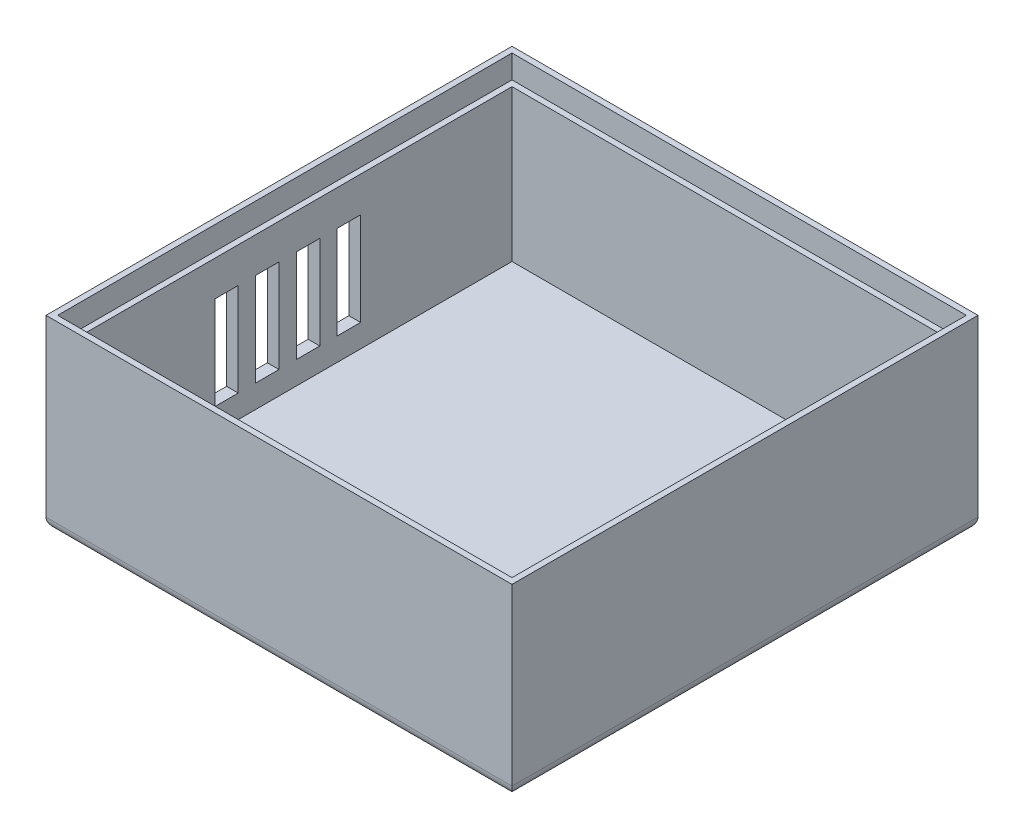
ISO-10303-21;
HEADER;
FILE_DESCRIPTION(('STEP AP214'),'2;1');
FILE_NAME('part.step','',(''),(''),'','','');
FILE_SCHEMA(('AUTOMOTIVE_DESIGN { 1 0 10303 214 1 1 1 1 }'));
ENDSEC;
DATA;
#1=APPLICATION_CONTEXT('core data for automotive mechanical design processes');
#2=APPLICATION_PROTOCOL_DEFINITION('international standard','automotive_design',2000,#1);
#3=PRODUCT_CONTEXT('',#1,'mechanical');
#4=PRODUCT('Part','Part','',(#3));
#5=PRODUCT_RELATED_PRODUCT_CATEGORY('part','',(#4));
#6=PRODUCT_DEFINITION_FORMATION('','',#4);
#7=PRODUCT_DEFINITION_CONTEXT('part definition',#1,'design');
#8=PRODUCT_DEFINITION('design','',#6,#7);
#9=PRODUCT_DEFINITION_SHAPE('','',#8);
#10=(LENGTH_UNIT() NAMED_UNIT(*) SI_UNIT(.MILLI.,.METRE.));
#11=(NAMED_UNIT(*) PLANE_ANGLE_UNIT() SI_UNIT($,.RADIAN.));
#12=(NAMED_UNIT(*) SI_UNIT($,.STERADIAN.) SOLID_ANGLE_UNIT());
#13=UNCERTAINTY_MEASURE_WITH_UNIT(LENGTH_MEASURE(1.E-05),#10,'distance_accuracy_value','');
#14=(GEOMETRIC_REPRESENTATION_CONTEXT(3) GLOBAL_UNCERTAINTY_ASSIGNED_CONTEXT((#13)) GLOBAL_UNIT_ASSIGNED_CONTEXT((#10,
#11,#12)) REPRESENTATION_CONTEXT('',''));
#15=CARTESIAN_POINT('',(0.,0.,0.));
#16=DIRECTION('',(0.,0.,1.));
#17=DIRECTION('',(1.,0.,0.));
#18=AXIS2_PLACEMENT_3D('',#15,#16,#17);
#19=CARTESIAN_POINT('',(-1.085,16.,-0.539));
#20=DIRECTION('',(1.,0.,0.));
#21=DIRECTION('',(0.,0.,-1.));
#22=AXIS2_PLACEMENT_3D('',#19,#20,#21);
#23=PLANE('',#22);
#24=DIRECTION('',(0.,0.,1.));
#25=VECTOR('',#24,1.);
#26=CARTESIAN_POINT('',(-1.085,2.97099138288034,13.461));
#27=LINE('',#26,#25);
#28=CARTESIAN_POINT('',(-1.085,2.97099138288034,13.461));
#29=VERTEX_POINT('',#28);
#30=CARTESIAN_POINT('',(-1.085,2.97099138288034,15.461));
#31=VERTEX_POINT('',#30);
#32=EDGE_CURVE('E248',#29,#31,#27,.T.);
#33=ORIENTED_EDGE('',*,*,#32,.F.);
#34=DIRECTION('',(0.,-1.,0.));
#35=VECTOR('',#34,1.);
#36=CARTESIAN_POINT('',(-1.085,10.9709913828803,13.461));
#37=LINE('',#36,#35);
#38=CARTESIAN_POINT('',(-1.085,10.9709913828803,13.461));
#39=VERTEX_POINT('',#38);
#40=EDGE_CURVE('E49',#39,#29,#37,.T.);
#41=ORIENTED_EDGE('',*,*,#40,.F.);
#42=DIRECTION('',(0.,0.,-1.));
#43=VECTOR('',#42,1.);
#44=CARTESIAN_POINT('',(-1.085,10.9709913828803,13.461));
#45=LINE('',#44,#43);
#46=CARTESIAN_POINT('',(-1.085,10.9709913828803,15.461));
#47=VERTEX_POINT('',#46);
#48=EDGE_CURVE('E254',#47,#39,#45,.T.);
#49=ORIENTED_EDGE('',*,*,#48,.F.);
#50=DIRECTION('',(0.,1.,0.));
#51=VECTOR('',#50,1.);
#52=CARTESIAN_POINT('',(-1.085,10.9709913828803,15.461));
#53=LINE('',#52,#51);
#54=EDGE_CURVE('E238',#31,#47,#53,.T.);
#55=ORIENTED_EDGE('',*,*,#54,.F.);
#56=EDGE_LOOP('',(#33,#41,#49,#55));
#57=FACE_BOUND('',#56,.T.);
#58=DIRECTION('',(0.,-1.,0.));
#59=VECTOR('',#58,1.);
#60=CARTESIAN_POINT('',(-1.085,10.9709913828803,16.961));
#61=LINE('',#60,#59);
#62=CARTESIAN_POINT('',(-1.085,10.9709913828803,16.961));
#63=VERTEX_POINT('',#62);
#64=CARTESIAN_POINT('',(-1.085,2.97099138288034,16.961));
#65=VERTEX_POINT('',#64);
#66=EDGE_CURVE('E265',#63,#65,#61,.T.);
#67=ORIENTED_EDGE('',*,*,#66,.F.);
#68=DIRECTION('',(0.,0.,-1.));
#69=VECTOR('',#68,1.);
#70=CARTESIAN_POINT('',(-1.085,10.9709913828803,16.961));
#71=LINE('',#70,#69);
#72=CARTESIAN_POINT('',(-1.085,10.9709913828803,18.961));
#73=VERTEX_POINT('',#72);
#74=EDGE_CURVE('E57',#73,#63,#71,.T.);
#75=ORIENTED_EDGE('',*,*,#74,.F.);
#76=DIRECTION('',(0.,1.,0.));
#77=VECTOR('',#76,1.);
#78=CARTESIAN_POINT('',(-1.085,10.9709913828803,18.961));
#79=LINE('',#78,#77);
#80=CARTESIAN_POINT('',(-1.085,2.97099138288034,18.961));
#81=VERTEX_POINT('',#80);
#82=EDGE_CURVE('E272',#81,#73,#79,.T.);
#83=ORIENTED_EDGE('',*,*,#82,.F.);
#84=DIRECTION('',(0.,0.,1.));
#85=VECTOR('',#84,1.);
#86=CARTESIAN_POINT('',(-1.085,2.97099138288034,16.961));
#87=LINE('',#86,#85);
#88=EDGE_CURVE('E269',#65,#81,#87,.T.);
#89=ORIENTED_EDGE('',*,*,#88,.F.);
#90=EDGE_LOOP('',(#67,#75,#83,#89));
#91=FACE_BOUND('',#90,.T.);
#92=DIRECTION('',(0.,-1.,0.));
#93=VECTOR('',#92,1.);
#94=CARTESIAN_POINT('',(-1.085,10.9709913828803,20.461));
#95=LINE('',#94,#93);
#96=CARTESIAN_POINT('',(-1.085,10.9709913828803,20.461));
#97=VERTEX_POINT('',#96);
#98=CARTESIAN_POINT('',(-1.085,2.97099138288034,20.461));
#99=VERTEX_POINT('',#98);
#100=EDGE_CURVE('E285',#97,#99,#95,.T.);
#101=ORIENTED_EDGE('',*,*,#100,.F.);
#102=DIRECTION('',(0.,0.,-1.));
#103=VECTOR('',#102,1.);
#104=CARTESIAN_POINT('',(-1.085,10.9709913828803,20.461));
#105=LINE('',#104,#103);
#106=CARTESIAN_POINT('',(-1.085,10.9709913828803,22.461));
#107=VERTEX_POINT('',#106);
#108=EDGE_CURVE('E283',#107,#97,#105,.T.);
#109=ORIENTED_EDGE('',*,*,#108,.F.);
#110=DIRECTION('',(0.,1.,0.));
#111=VECTOR('',#110,1.);
#112=CARTESIAN_POINT('',(-1.085,10.9709913828803,22.461));
#113=LINE('',#112,#111);
#114=CARTESIAN_POINT('',(-1.085,2.97099138288034,22.461));
#115=VERTEX_POINT('',#114);
#116=EDGE_CURVE('E292',#115,#107,#113,.T.);
#117=ORIENTED_EDGE('',*,*,#116,.F.);
#118=DIRECTION('',(0.,0.,1.));
#119=VECTOR('',#118,1.);
#120=CARTESIAN_POINT('',(-1.085,2.97099138288034,20.461));
#121=LINE('',#120,#119);
#122=EDGE_CURVE('E289',#99,#115,#121,.T.);
#123=ORIENTED_EDGE('',*,*,#122,.F.);
#124=EDGE_LOOP('',(#101,#109,#117,#123));
#125=FACE_BOUND('',#124,.T.);
#126=DIRECTION('',(0.,-1.,0.));
#127=VECTOR('',#126,1.);
#128=CARTESIAN_POINT('',(-1.085,10.9709913828803,23.961));
#129=LINE('',#128,#127);
#130=CARTESIAN_POINT('',(-1.085,10.9709913828803,23.961));
#131=VERTEX_POINT('',#130);
#132=CARTESIAN_POINT('',(-1.085,2.97099138288034,23.961));
#133=VERTEX_POINT('',#132);
#134=EDGE_CURVE('E305',#131,#133,#129,.T.);
#135=ORIENTED_EDGE('',*,*,#134,.F.);
#136=DIRECTION('',(0.,0.,-1.));
#137=VECTOR('',#136,1.);
#138=CARTESIAN_POINT('',(-1.085,10.9709913828803,23.961));
#139=LINE('',#138,#137);
#140=CARTESIAN_POINT('',(-1.085,10.9709913828803,25.961));
#141=VERTEX_POINT('',#140);
#142=EDGE_CURVE('E303',#141,#131,#139,.T.);
#143=ORIENTED_EDGE('',*,*,#142,.F.);
#144=DIRECTION('',(0.,1.,0.));
#145=VECTOR('',#144,1.);
#146=CARTESIAN_POINT('',(-1.085,10.9709913828803,25.961));
#147=LINE('',#146,#145);
#148=CARTESIAN_POINT('',(-1.085,2.97099138288034,25.961));
#149=VERTEX_POINT('',#148);
#150=EDGE_CURVE('E311',#149,#141,#147,.T.);
#151=ORIENTED_EDGE('',*,*,#150,.F.);
#152=DIRECTION('',(0.,0.,1.));
#153=VECTOR('',#152,1.);
#154=CARTESIAN_POINT('',(-1.085,2.97099138288034,23.961));
#155=LINE('',#154,#153);
#156=EDGE_CURVE('E308',#133,#149,#155,.T.);
#157=ORIENTED_EDGE('',*,*,#156,.F.);
#158=EDGE_LOOP('',(#135,#143,#151,#157));
#159=FACE_BOUND('',#158,.T.);
#160=DIRECTION('',(0.,-1.,0.));
#161=VECTOR('',#160,1.);
#162=CARTESIAN_POINT('',(-1.085,16.,-0.539));
#163=LINE('',#162,#161);
#164=CARTESIAN_POINT('',(-1.085,16.,-0.539));
#165=VERTEX_POINT('',#164);
#166=CARTESIAN_POINT('',(-1.085,1.,-0.539));
#167=VERTEX_POINT('',#166);
#168=EDGE_CURVE('E399',#165,#167,#163,.T.);
#169=ORIENTED_EDGE('',*,*,#168,.T.);
#170=DIRECTION('',(0.,0.,1.));
#171=VECTOR('',#170,1.);
#172=CARTESIAN_POINT('',(-1.085,1.,-0.539));
#173=LINE('',#172,#171);
#174=CARTESIAN_POINT('',(-1.085,1.,39.461));
#175=VERTEX_POINT('',#174);
#176=EDGE_CURVE('E425',#167,#175,#173,.T.);
#177=ORIENTED_EDGE('',*,*,#176,.T.);
#178=DIRECTION('',(0.,-1.,0.));
#179=VECTOR('',#178,1.);
#180=CARTESIAN_POINT('',(-1.085,16.,39.461));
#181=LINE('',#180,#179);
#182=CARTESIAN_POINT('',(-1.085,16.,39.461));
#183=VERTEX_POINT('',#182);
#184=EDGE_CURVE('E408',#183,#175,#181,.T.);
#185=ORIENTED_EDGE('',*,*,#184,.F.);
#186=DIRECTION('',(0.,0.,1.));
#187=VECTOR('',#186,1.);
#188=CARTESIAN_POINT('',(-1.085,16.,-0.539));
#189=LINE('',#188,#187);
#190=EDGE_CURVE('E382',#165,#183,#189,.T.);
#191=ORIENTED_EDGE('',*,*,#190,.F.);
#192=EDGE_LOOP('',(#169,#177,#185,#191));
#193=FACE_BOUND('',#192,.T.);
#194=ADVANCED_FACE('F34',(#57,#91,#125,#159,#193),#23,.F.);
#195=CARTESIAN_POINT('',(-1.085,16.,39.461));
#196=DIRECTION('',(0.,0.,-1.));
#197=DIRECTION('',(-1.,0.,0.));
#198=AXIS2_PLACEMENT_3D('',#195,#196,#197);
#199=PLANE('',#198);
#200=ORIENTED_EDGE('',*,*,#184,.T.);
#201=DIRECTION('',(1.,0.,0.));
#202=VECTOR('',#201,1.);
#203=CARTESIAN_POINT('',(-1.085,1.,39.461));
#204=LINE('',#203,#202);
#205=CARTESIAN_POINT('',(38.915,1.,39.461));
#206=VERTEX_POINT('',#205);
#207=EDGE_CURVE('E423',#175,#206,#204,.T.);
#208=ORIENTED_EDGE('',*,*,#207,.T.);
#209=DIRECTION('',(0.,-1.,0.));
#210=VECTOR('',#209,1.);
#211=CARTESIAN_POINT('',(38.915,16.,39.461));
#212=LINE('',#211,#210);
#213=CARTESIAN_POINT('',(38.915,16.,39.461));
#214=VERTEX_POINT('',#213);
#215=EDGE_CURVE('E405',#214,#206,#212,.T.);
#216=ORIENTED_EDGE('',*,*,#215,.F.);
#217=DIRECTION('',(1.,0.,0.));
#218=VECTOR('',#217,1.);
#219=CARTESIAN_POINT('',(-1.085,16.,39.461));
#220=LINE('',#219,#218);
#221=EDGE_CURVE('E393',#183,#214,#220,.T.);
#222=ORIENTED_EDGE('',*,*,#221,.F.);
#223=EDGE_LOOP('',(#200,#208,#216,#222));
#224=FACE_BOUND('',#223,.T.);
#225=ADVANCED_FACE('F497',(#224),#199,.F.);
#226=CARTESIAN_POINT('',(38.915,16.,-0.539));
#227=DIRECTION('',(-1.,0.,0.));
#228=DIRECTION('',(0.,0.,1.));
#229=AXIS2_PLACEMENT_3D('',#226,#227,#228);
#230=PLANE('',#229);
#231=ORIENTED_EDGE('',*,*,#215,.T.);
#232=DIRECTION('',(0.,0.,-1.));
#233=VECTOR('',#232,1.);
#234=CARTESIAN_POINT('',(38.915,1.,-0.539));
#235=LINE('',#234,#233);
#236=CARTESIAN_POINT('',(38.915,1.,-0.539));
#237=VERTEX_POINT('',#236);
#238=EDGE_CURVE('E411',#206,#237,#235,.T.);
#239=ORIENTED_EDGE('',*,*,#238,.T.);
#240=DIRECTION('',(0.,-1.,0.));
#241=VECTOR('',#240,1.);
#242=CARTESIAN_POINT('',(38.915,16.,-0.539));
#243=LINE('',#242,#241);
#244=CARTESIAN_POINT('',(38.915,16.,-0.539));
#245=VERTEX_POINT('',#244);
#246=EDGE_CURVE('E402',#245,#237,#243,.T.);
#247=ORIENTED_EDGE('',*,*,#246,.F.);
#248=DIRECTION('',(0.,0.,-1.));
#249=VECTOR('',#248,1.);
#250=CARTESIAN_POINT('',(38.915,16.,-0.539));
#251=LINE('',#250,#249);
#252=EDGE_CURVE('E395',#214,#245,#251,.T.);
#253=ORIENTED_EDGE('',*,*,#252,.F.);
#254=EDGE_LOOP('',(#231,#239,#247,#253));
#255=FACE_BOUND('',#254,.T.);
#256=ADVANCED_FACE('F502',(#255),#230,.F.);
#257=CARTESIAN_POINT('',(-1.085,16.,-0.539));
#258=DIRECTION('',(0.,0.,1.));
#259=DIRECTION('',(1.,0.,0.));
#260=AXIS2_PLACEMENT_3D('',#257,#258,#259);
#261=PLANE('',#260);
#262=ORIENTED_EDGE('',*,*,#246,.T.);
#263=DIRECTION('',(-1.,0.,0.));
#264=VECTOR('',#263,1.);
#265=CARTESIAN_POINT('',(-1.085,1.,-0.539));
#266=LINE('',#265,#264);
#267=EDGE_CURVE('E427',#237,#167,#266,.T.);
#268=ORIENTED_EDGE('',*,*,#267,.T.);
#269=ORIENTED_EDGE('',*,*,#168,.F.);
#270=DIRECTION('',(-1.,0.,0.));
#271=VECTOR('',#270,1.);
#272=CARTESIAN_POINT('',(-1.085,16.,-0.539));
#273=LINE('',#272,#271);
#274=EDGE_CURVE('E397',#245,#165,#273,.T.);
#275=ORIENTED_EDGE('',*,*,#274,.F.);
#276=EDGE_LOOP('',(#262,#268,#269,#275));
#277=FACE_BOUND('',#276,.T.);
#278=ADVANCED_FACE('F544',(#277),#261,.F.);
#279=CARTESIAN_POINT('',(0.,16.,0.));
#280=DIRECTION('',(0.,1.,0.));
#281=DIRECTION('',(0.,0.,1.));
#282=AXIS2_PLACEMENT_3D('',#279,#280,#281);
#283=PLANE('',#282);
#284=DIRECTION('',(-1.,0.,0.));
#285=VECTOR('',#284,1.);
#286=CARTESIAN_POINT('',(37.915,16.,-0.039));
#287=LINE('',#286,#285);
#288=CARTESIAN_POINT('',(38.415,16.,-0.0390000000000001));
#289=VERTEX_POINT('',#288);
#290=CARTESIAN_POINT('',(-0.585000000000013,16.,-0.039));
#291=VERTEX_POINT('',#290);
#292=EDGE_CURVE('E336',#289,#291,#287,.T.);
#293=ORIENTED_EDGE('',*,*,#292,.F.);
#294=DIRECTION('',(0.,0.,-1.));
#295=VECTOR('',#294,1.);
#296=CARTESIAN_POINT('',(38.415,16.,-0.0390000000000001));
#297=LINE('',#296,#295);
#298=CARTESIAN_POINT('',(38.415,16.,38.961));
#299=VERTEX_POINT('',#298);
#300=EDGE_CURVE('E331',#299,#289,#297,.T.);
#301=ORIENTED_EDGE('',*,*,#300,.F.);
#302=DIRECTION('',(1.,0.,0.));
#303=VECTOR('',#302,1.);
#304=CARTESIAN_POINT('',(37.915,16.,38.961));
#305=LINE('',#304,#303);
#306=CARTESIAN_POINT('',(-0.584999999999996,16.,38.961));
#307=VERTEX_POINT('',#306);
#308=EDGE_CURVE('E360',#307,#299,#305,.T.);
#309=ORIENTED_EDGE('',*,*,#308,.F.);
#310=DIRECTION('',(0.,0.,1.));
#311=VECTOR('',#310,1.);
#312=CARTESIAN_POINT('',(-0.585000000000001,16.,0.461));
#313=LINE('',#312,#311);
#314=EDGE_CURVE('E347',#291,#307,#313,.T.);
#315=ORIENTED_EDGE('',*,*,#314,.F.);
#316=EDGE_LOOP('',(#293,#301,#309,#315));
#317=FACE_BOUND('',#316,.T.);
#318=ORIENTED_EDGE('',*,*,#190,.T.);
#319=ORIENTED_EDGE('',*,*,#221,.T.);
#320=ORIENTED_EDGE('',*,*,#252,.T.);
#321=ORIENTED_EDGE('',*,*,#274,.T.);
#322=EDGE_LOOP('',(#318,#319,#320,#321));
#323=FACE_BOUND('',#322,.T.);
#324=ADVANCED_FACE('F547',(#317,#323),#283,.T.);
#325=CARTESIAN_POINT('',(0.,0.,0.));
#326=DIRECTION('',(0.,1.,0.));
#327=DIRECTION('',(0.,0.,1.));
#328=AXIS2_PLACEMENT_3D('',#325,#326,#327);
#329=PLANE('',#328);
#330=DIRECTION('',(-1.,0.,0.));
#331=VECTOR('',#330,1.);
#332=CARTESIAN_POINT('',(0.,0.,0.461));
#333=LINE('',#332,#331);
#334=CARTESIAN_POINT('',(-0.0850000000000003,0.,0.461));
#335=VERTEX_POINT('',#334);
#336=CARTESIAN_POINT('',(37.915,0.,0.461));
#337=VERTEX_POINT('',#336);
#338=EDGE_CURVE('E414',#335,#337,#333,.F.);
#339=ORIENTED_EDGE('',*,*,#338,.T.);
#340=DIRECTION('',(0.,0.,-1.));
#341=VECTOR('',#340,1.);
#342=CARTESIAN_POINT('',(37.915,0.,0.));
#343=LINE('',#342,#341);
#344=CARTESIAN_POINT('',(37.915,0.,38.461));
#345=VERTEX_POINT('',#344);
#346=EDGE_CURVE('E420',#337,#345,#343,.F.);
#347=ORIENTED_EDGE('',*,*,#346,.T.);
#348=DIRECTION('',(1.,0.,0.));
#349=VECTOR('',#348,1.);
#350=CARTESIAN_POINT('',(0.,0.,38.461));
#351=LINE('',#350,#349);
#352=CARTESIAN_POINT('',(-0.0849999999999956,0.,38.461));
#353=VERTEX_POINT('',#352);
#354=EDGE_CURVE('E418',#345,#353,#351,.F.);
#355=ORIENTED_EDGE('',*,*,#354,.T.);
#356=DIRECTION('',(0.,0.,1.));
#357=VECTOR('',#356,1.);
#358=CARTESIAN_POINT('',(-0.0850000000000004,0.,0.));
#359=LINE('',#358,#357);
#360=EDGE_CURVE('E416',#353,#335,#359,.F.);
#361=ORIENTED_EDGE('',*,*,#360,.T.);
#362=EDGE_LOOP('',(#339,#347,#355,#361));
#363=FACE_BOUND('',#362,.T.);
#364=ADVANCED_FACE('F532',(#363),#329,.F.);
#365=CARTESIAN_POINT('',(-0.0850000000000007,1.,0.461));
#366=DIRECTION('',(-1.,0.,0.));
#367=DIRECTION('',(0.,0.,1.));
#368=AXIS2_PLACEMENT_3D('',#365,#366,#367);
#369=PLANE('',#368);
#370=DIRECTION('',(0.,0.,-1.));
#371=VECTOR('',#370,1.);
#372=CARTESIAN_POINT('',(-0.0850000000000007,10.9709913828803,0.461));
#373=LINE('',#372,#371);
#374=CARTESIAN_POINT('',(-0.0849999999999983,10.9709913828803,15.461));
#375=VERTEX_POINT('',#374);
#376=CARTESIAN_POINT('',(-0.0849999999999983,10.9709913828803,13.461));
#377=VERTEX_POINT('',#376);
#378=EDGE_CURVE('E42',#375,#377,#373,.T.);
#379=ORIENTED_EDGE('',*,*,#378,.T.);
#380=DIRECTION('',(0.,-1.,0.));
#381=VECTOR('',#380,1.);
#382=CARTESIAN_POINT('',(-0.084999999999999,1.00000000000001,13.461));
#383=LINE('',#382,#381);
#384=CARTESIAN_POINT('',(-0.0849999999999983,2.97099138288034,13.461));
#385=VERTEX_POINT('',#384);
#386=EDGE_CURVE('E11',#377,#385,#383,.T.);
#387=ORIENTED_EDGE('',*,*,#386,.T.);
#388=DIRECTION('',(0.,0.,1.));
#389=VECTOR('',#388,1.);
#390=CARTESIAN_POINT('',(-0.0850000000000007,2.97099138288034,0.461));
#391=LINE('',#390,#389);
#392=CARTESIAN_POINT('',(-0.0849999999999988,2.97099138288034,15.461));
#393=VERTEX_POINT('',#392);
#394=EDGE_CURVE('E473',#385,#393,#391,.T.);
#395=ORIENTED_EDGE('',*,*,#394,.T.);
#396=DIRECTION('',(0.,1.,0.));
#397=VECTOR('',#396,1.);
#398=CARTESIAN_POINT('',(-0.0849999999999988,1.,15.461));
#399=LINE('',#398,#397);
#400=EDGE_CURVE('E241',#393,#375,#399,.T.);
#401=ORIENTED_EDGE('',*,*,#400,.T.);
#402=EDGE_LOOP('',(#379,#387,#395,#401));
#403=FACE_BOUND('',#402,.T.);
#404=DIRECTION('',(0.,1.,0.));
#405=VECTOR('',#404,1.);
#406=CARTESIAN_POINT('',(-0.0849999999999983,1.00000000000001,18.961));
#407=LINE('',#406,#405);
#408=CARTESIAN_POINT('',(-0.0849999999999983,2.97099138288034,18.961));
#409=VERTEX_POINT('',#408);
#410=CARTESIAN_POINT('',(-0.0849999999999983,10.9709913828803,18.961));
#411=VERTEX_POINT('',#410);
#412=EDGE_CURVE('E467',#409,#411,#407,.T.);
#413=ORIENTED_EDGE('',*,*,#412,.T.);
#414=DIRECTION('',(0.,0.,-1.));
#415=VECTOR('',#414,1.);
#416=CARTESIAN_POINT('',(-0.0850000000000007,10.9709913828803,0.461));
#417=LINE('',#416,#415);
#418=CARTESIAN_POINT('',(-0.0849999999999983,10.9709913828803,16.961));
#419=VERTEX_POINT('',#418);
#420=EDGE_CURVE('E470',#411,#419,#417,.T.);
#421=ORIENTED_EDGE('',*,*,#420,.T.);
#422=DIRECTION('',(0.,-1.,0.));
#423=VECTOR('',#422,1.);
#424=CARTESIAN_POINT('',(-0.0849999999999986,1.00000000000001,16.961));
#425=LINE('',#424,#423);
#426=CARTESIAN_POINT('',(-0.0849999999999986,2.97099138288034,16.961));
#427=VERTEX_POINT('',#426);
#428=EDGE_CURVE('E461',#419,#427,#425,.T.);
#429=ORIENTED_EDGE('',*,*,#428,.T.);
#430=DIRECTION('',(0.,0.,1.));
#431=VECTOR('',#430,1.);
#432=CARTESIAN_POINT('',(-0.0850000000000007,2.97099138288034,0.461));
#433=LINE('',#432,#431);
#434=EDGE_CURVE('E464',#427,#409,#433,.T.);
#435=ORIENTED_EDGE('',*,*,#434,.T.);
#436=EDGE_LOOP('',(#413,#421,#429,#435));
#437=FACE_BOUND('',#436,.T.);
#438=DIRECTION('',(0.,1.,0.));
#439=VECTOR('',#438,1.);
#440=CARTESIAN_POINT('',(-0.0849999999999979,1.,22.461));
#441=LINE('',#440,#439);
#442=CARTESIAN_POINT('',(-0.0849999999999983,2.97099138288034,22.461));
#443=VERTEX_POINT('',#442);
#444=CARTESIAN_POINT('',(-0.0849999999999983,10.9709913828803,22.461));
#445=VERTEX_POINT('',#444);
#446=EDGE_CURVE('E455',#443,#445,#441,.T.);
#447=ORIENTED_EDGE('',*,*,#446,.T.);
#448=DIRECTION('',(0.,0.,-1.));
#449=VECTOR('',#448,1.);
#450=CARTESIAN_POINT('',(-0.0850000000000007,10.9709913828803,0.461));
#451=LINE('',#450,#449);
#452=CARTESIAN_POINT('',(-0.0849999999999983,10.9709913828803,20.461));
#453=VERTEX_POINT('',#452);
#454=EDGE_CURVE('E458',#445,#453,#451,.T.);
#455=ORIENTED_EDGE('',*,*,#454,.T.);
#456=DIRECTION('',(0.,-1.,0.));
#457=VECTOR('',#456,1.);
#458=CARTESIAN_POINT('',(-0.0849999999999981,1.00000000000001,20.461));
#459=LINE('',#458,#457);
#460=CARTESIAN_POINT('',(-0.0849999999999981,2.97099138288034,20.461));
#461=VERTEX_POINT('',#460);
#462=EDGE_CURVE('E449',#453,#461,#459,.T.);
#463=ORIENTED_EDGE('',*,*,#462,.T.);
#464=DIRECTION('',(0.,0.,1.));
#465=VECTOR('',#464,1.);
#466=CARTESIAN_POINT('',(-0.0850000000000007,2.97099138288034,0.461));
#467=LINE('',#466,#465);
#468=EDGE_CURVE('E452',#461,#443,#467,.T.);
#469=ORIENTED_EDGE('',*,*,#468,.T.);
#470=EDGE_LOOP('',(#447,#455,#463,#469));
#471=FACE_BOUND('',#470,.T.);
#472=DIRECTION('',(0.,1.,0.));
#473=VECTOR('',#472,1.);
#474=CARTESIAN_POINT('',(-0.0849999999999974,1.00000000000001,25.961));
#475=LINE('',#474,#473);
#476=CARTESIAN_POINT('',(-0.0849999999999983,2.97099138288034,25.961));
#477=VERTEX_POINT('',#476);
#478=CARTESIAN_POINT('',(-0.0849999999999965,10.9709913828803,25.961));
#479=VERTEX_POINT('',#478);
#480=EDGE_CURVE('E443',#477,#479,#475,.T.);
#481=ORIENTED_EDGE('',*,*,#480,.T.);
#482=DIRECTION('',(0.,0.,-1.));
#483=VECTOR('',#482,1.);
#484=CARTESIAN_POINT('',(-0.0850000000000007,10.9709913828803,0.461));
#485=LINE('',#484,#483);
#486=CARTESIAN_POINT('',(-0.0849999999999983,10.9709913828803,23.961));
#487=VERTEX_POINT('',#486);
#488=EDGE_CURVE('E446',#479,#487,#485,.T.);
#489=ORIENTED_EDGE('',*,*,#488,.T.);
#490=DIRECTION('',(0.,-1.,0.));
#491=VECTOR('',#490,1.);
#492=CARTESIAN_POINT('',(-0.0849999999999977,1.00000000000001,23.961));
#493=LINE('',#492,#491);
#494=CARTESIAN_POINT('',(-0.0849999999999977,2.97099138288034,23.961));
#495=VERTEX_POINT('',#494);
#496=EDGE_CURVE('E429',#487,#495,#493,.T.);
#497=ORIENTED_EDGE('',*,*,#496,.T.);
#498=DIRECTION('',(0.,0.,1.));
#499=VECTOR('',#498,1.);
#500=CARTESIAN_POINT('',(-0.0850000000000007,2.97099138288034,0.461));
#501=LINE('',#500,#499);
#502=EDGE_CURVE('E440',#495,#477,#501,.T.);
#503=ORIENTED_EDGE('',*,*,#502,.T.);
#504=EDGE_LOOP('',(#481,#489,#497,#503));
#505=FACE_BOUND('',#504,.T.);
#506=DIRECTION('',(0.,1.,0.));
#507=VECTOR('',#506,1.);
#508=CARTESIAN_POINT('',(-0.0850000000000007,1.,0.461));
#509=LINE('',#508,#507);
#510=CARTESIAN_POINT('',(-0.0850000000000007,1.,0.461));
#511=VERTEX_POINT('',#510);
#512=CARTESIAN_POINT('',(-0.0850000000000017,14.,0.461));
#513=VERTEX_POINT('',#512);
#514=EDGE_CURVE('E379',#511,#513,#509,.T.);
#515=ORIENTED_EDGE('',*,*,#514,.T.);
#516=DIRECTION('',(0.,0.,-1.));
#517=VECTOR('',#516,1.);
#518=CARTESIAN_POINT('',(-0.0850000000000007,14.,0.461));
#519=LINE('',#518,#517);
#520=CARTESIAN_POINT('',(-0.0849999999999961,14.,38.461));
#521=VERTEX_POINT('',#520);
#522=EDGE_CURVE('E344',#521,#513,#519,.T.);
#523=ORIENTED_EDGE('',*,*,#522,.F.);
#524=DIRECTION('',(0.,1.,0.));
#525=VECTOR('',#524,1.);
#526=CARTESIAN_POINT('',(-0.0849999999999958,1.,38.461));
#527=LINE('',#526,#525);
#528=CARTESIAN_POINT('',(-0.0849999999999958,1.,38.461));
#529=VERTEX_POINT('',#528);
#530=EDGE_CURVE('E378',#529,#521,#527,.T.);
#531=ORIENTED_EDGE('',*,*,#530,.F.);
#532=DIRECTION('',(0.,0.,1.));
#533=VECTOR('',#532,1.);
#534=CARTESIAN_POINT('',(-0.0850000000000007,1.,0.461));
#535=LINE('',#534,#533);
#536=EDGE_CURVE('E365',#511,#529,#535,.T.);
#537=ORIENTED_EDGE('',*,*,#536,.F.);
#538=EDGE_LOOP('',(#515,#523,#531,#537));
#539=FACE_BOUND('',#538,.T.);
#540=ADVANCED_FACE('F477',(#403,#437,#471,#505,#539),#369,.F.);
#541=CARTESIAN_POINT('',(-0.0850000000000007,1.,0.461));
#542=DIRECTION('',(0.,0.,-1.));
#543=DIRECTION('',(-1.,0.,0.));
#544=AXIS2_PLACEMENT_3D('',#541,#542,#543);
#545=PLANE('',#544);
#546=DIRECTION('',(0.,1.,0.));
#547=VECTOR('',#546,1.);
#548=CARTESIAN_POINT('',(37.915,1.,0.461));
#549=LINE('',#548,#547);
#550=CARTESIAN_POINT('',(37.915,1.,0.461));
#551=VERTEX_POINT('',#550);
#552=CARTESIAN_POINT('',(37.915,14.,0.461000000000003));
#553=VERTEX_POINT('',#552);
#554=EDGE_CURVE('E383',#551,#553,#549,.T.);
#555=ORIENTED_EDGE('',*,*,#554,.T.);
#556=DIRECTION('',(1.,0.,0.));
#557=VECTOR('',#556,1.);
#558=CARTESIAN_POINT('',(37.915,14.,0.461));
#559=LINE('',#558,#557);
#560=EDGE_CURVE('E334',#513,#553,#559,.T.);
#561=ORIENTED_EDGE('',*,*,#560,.F.);
#562=ORIENTED_EDGE('',*,*,#514,.F.);
#563=DIRECTION('',(-1.,0.,0.));
#564=VECTOR('',#563,1.);
#565=CARTESIAN_POINT('',(-0.0850000000000007,1.,0.461));
#566=LINE('',#565,#564);
#567=EDGE_CURVE('E375',#551,#511,#566,.T.);
#568=ORIENTED_EDGE('',*,*,#567,.F.);
#569=EDGE_LOOP('',(#555,#561,#562,#568));
#570=FACE_BOUND('',#569,.T.);
#571=ADVANCED_FACE('F630',(#570),#545,.F.);
#572=CARTESIAN_POINT('',(37.915,1.,0.461));
#573=DIRECTION('',(1.,0.,0.));
#574=DIRECTION('',(0.,0.,-1.));
#575=AXIS2_PLACEMENT_3D('',#572,#573,#574);
#576=PLANE('',#575);
#577=DIRECTION('',(0.,1.,0.));
#578=VECTOR('',#577,1.);
#579=CARTESIAN_POINT('',(37.915,1.,38.461));
#580=LINE('',#579,#578);
#581=CARTESIAN_POINT('',(37.915,1.,38.461));
#582=VERTEX_POINT('',#581);
#583=CARTESIAN_POINT('',(37.915,14.,38.461));
#584=VERTEX_POINT('',#583);
#585=EDGE_CURVE('E386',#582,#584,#580,.T.);
#586=ORIENTED_EDGE('',*,*,#585,.T.);
#587=DIRECTION('',(0.,0.,1.));
#588=VECTOR('',#587,1.);
#589=CARTESIAN_POINT('',(37.915,14.,-0.039));
#590=LINE('',#589,#588);
#591=EDGE_CURVE('E261',#553,#584,#590,.T.);
#592=ORIENTED_EDGE('',*,*,#591,.F.);
#593=ORIENTED_EDGE('',*,*,#554,.F.);
#594=DIRECTION('',(0.,0.,-1.));
#595=VECTOR('',#594,1.);
#596=CARTESIAN_POINT('',(37.915,1.,0.461));
#597=LINE('',#596,#595);
#598=EDGE_CURVE('E372',#582,#551,#597,.T.);
#599=ORIENTED_EDGE('',*,*,#598,.F.);
#600=EDGE_LOOP('',(#586,#592,#593,#599));
#601=FACE_BOUND('',#600,.T.);
#602=ADVANCED_FACE('F635',(#601),#576,.F.);
#603=CARTESIAN_POINT('',(-0.0849999999999958,1.,38.461));
#604=DIRECTION('',(0.,0.,1.));
#605=DIRECTION('',(1.,0.,0.));
#606=AXIS2_PLACEMENT_3D('',#603,#604,#605);
#607=PLANE('',#606);
#608=ORIENTED_EDGE('',*,*,#530,.T.);
#609=DIRECTION('',(-1.,0.,0.));
#610=VECTOR('',#609,1.);
#611=CARTESIAN_POINT('',(37.915,14.,38.461));
#612=LINE('',#611,#610);
#613=EDGE_CURVE('E355',#584,#521,#612,.T.);
#614=ORIENTED_EDGE('',*,*,#613,.F.);
#615=ORIENTED_EDGE('',*,*,#585,.F.);
#616=DIRECTION('',(1.,0.,0.));
#617=VECTOR('',#616,1.);
#618=CARTESIAN_POINT('',(-0.0849999999999958,1.,38.461));
#619=LINE('',#618,#617);
#620=EDGE_CURVE('E368',#529,#582,#619,.T.);
#621=ORIENTED_EDGE('',*,*,#620,.F.);
#622=EDGE_LOOP('',(#608,#614,#615,#621));
#623=FACE_BOUND('',#622,.T.);
#624=ADVANCED_FACE('F648',(#623),#607,.F.);
#625=CARTESIAN_POINT('',(0.,1.,0.));
#626=DIRECTION('',(0.,1.,0.));
#627=DIRECTION('',(0.,0.,1.));
#628=AXIS2_PLACEMENT_3D('',#625,#626,#627);
#629=PLANE('',#628);
#630=ORIENTED_EDGE('',*,*,#536,.T.);
#631=ORIENTED_EDGE('',*,*,#620,.T.);
#632=ORIENTED_EDGE('',*,*,#598,.T.);
#633=ORIENTED_EDGE('',*,*,#567,.T.);
#634=EDGE_LOOP('',(#630,#631,#632,#633));
#635=FACE_BOUND('',#634,.T.);
#636=ADVANCED_FACE('F521',(#635),#629,.T.);
#637=CARTESIAN_POINT('',(-0.0850000000000004,1.,-0.539));
#638=DIRECTION('',(0.,0.,1.));
#639=DIRECTION('',(1.,0.,0.));
#640=AXIS2_PLACEMENT_3D('',#637,#638,#639);
#641=CYLINDRICAL_SURFACE('',#640,1.);
#642=CARTESIAN_POINT('',(-0.0850000000000003,1.,0.461));
#643=DIRECTION('',(-0.707106781186547,0.,0.707106781186548));
#644=DIRECTION('',(-0.707106781186548,0.,-0.707106781186547));
#645=AXIS2_PLACEMENT_3D('',#642,#643,#644);
#646=ELLIPSE('',#645,1.4142135623731,1.);
#647=EDGE_CURVE('E433',#335,#167,#646,.F.);
#648=ORIENTED_EDGE('',*,*,#647,.F.);
#649=ORIENTED_EDGE('',*,*,#360,.F.);
#650=CARTESIAN_POINT('',(-0.0849999999999956,1.,38.461));
#651=DIRECTION('',(0.707106781186548,0.,0.707106781186547));
#652=DIRECTION('',(-0.707106781186547,0.,0.707106781186548));
#653=AXIS2_PLACEMENT_3D('',#650,#651,#652);
#654=ELLIPSE('',#653,1.41421356237309,1.);
#655=EDGE_CURVE('E369',#175,#353,#654,.T.);
#656=ORIENTED_EDGE('',*,*,#655,.F.);
#657=ORIENTED_EDGE('',*,*,#176,.F.);
#658=EDGE_LOOP('',(#648,#649,#656,#657));
#659=FACE_BOUND('',#658,.T.);
#660=ADVANCED_FACE('F36',(#659),#641,.T.);
#661=CARTESIAN_POINT('',(-1.085,1.,38.461));
#662=DIRECTION('',(1.,0.,0.));
#663=DIRECTION('',(0.,0.,-1.));
#664=AXIS2_PLACEMENT_3D('',#661,#662,#663);
#665=CYLINDRICAL_SURFACE('',#664,1.);
#666=ORIENTED_EDGE('',*,*,#655,.T.);
#667=ORIENTED_EDGE('',*,*,#354,.F.);
#668=CARTESIAN_POINT('',(37.915,1.,38.461));
#669=DIRECTION('',(0.707106781186547,0.,-0.707106781186548));
#670=DIRECTION('',(0.707106781186548,0.,0.707106781186547));
#671=AXIS2_PLACEMENT_3D('',#668,#669,#670);
#672=ELLIPSE('',#671,1.4142135623731,1.);
#673=EDGE_CURVE('E431',#206,#345,#672,.T.);
#674=ORIENTED_EDGE('',*,*,#673,.F.);
#675=ORIENTED_EDGE('',*,*,#207,.F.);
#676=EDGE_LOOP('',(#666,#667,#674,#675));
#677=FACE_BOUND('',#676,.T.);
#678=ADVANCED_FACE('F514',(#677),#665,.T.);
#679=CARTESIAN_POINT('',(-1.085,1.,0.461));
#680=DIRECTION('',(-1.,0.,0.));
#681=DIRECTION('',(0.,0.,1.));
#682=AXIS2_PLACEMENT_3D('',#679,#680,#681);
#683=CYLINDRICAL_SURFACE('',#682,1.);
#684=ORIENTED_EDGE('',*,*,#647,.T.);
#685=ORIENTED_EDGE('',*,*,#267,.F.);
#686=CARTESIAN_POINT('',(37.915,1.,0.461));
#687=DIRECTION('',(-0.707106781186548,0.,-0.707106781186547));
#688=DIRECTION('',(-0.707106781186547,0.,0.707106781186548));
#689=AXIS2_PLACEMENT_3D('',#686,#687,#688);
#690=ELLIPSE('',#689,1.41421356237309,1.);
#691=EDGE_CURVE('E362',#337,#237,#690,.F.);
#692=ORIENTED_EDGE('',*,*,#691,.F.);
#693=ORIENTED_EDGE('',*,*,#338,.F.);
#694=EDGE_LOOP('',(#684,#685,#692,#693));
#695=FACE_BOUND('',#694,.T.);
#696=ADVANCED_FACE('F511',(#695),#683,.T.);
#697=CARTESIAN_POINT('',(37.915,1.,-0.539));
#698=DIRECTION('',(0.,0.,-1.));
#699=DIRECTION('',(-1.,0.,0.));
#700=AXIS2_PLACEMENT_3D('',#697,#698,#699);
#701=CYLINDRICAL_SURFACE('',#700,1.);
#702=ORIENTED_EDGE('',*,*,#673,.T.);
#703=ORIENTED_EDGE('',*,*,#346,.F.);
#704=ORIENTED_EDGE('',*,*,#691,.T.);
#705=ORIENTED_EDGE('',*,*,#238,.F.);
#706=EDGE_LOOP('',(#702,#703,#704,#705));
#707=FACE_BOUND('',#706,.T.);
#708=ADVANCED_FACE('F507',(#707),#701,.T.);
#709=CARTESIAN_POINT('',(37.915,14.,38.961));
#710=DIRECTION('',(0.,-1.,0.));
#711=DIRECTION('',(0.,0.,-1.));
#712=AXIS2_PLACEMENT_3D('',#709,#710,#711);
#713=PLANE('',#712);
#714=ORIENTED_EDGE('',*,*,#591,.T.);
#715=ORIENTED_EDGE('',*,*,#613,.T.);
#716=ORIENTED_EDGE('',*,*,#522,.T.);
#717=ORIENTED_EDGE('',*,*,#560,.T.);
#718=EDGE_LOOP('',(#714,#715,#716,#717));
#719=FACE_BOUND('',#718,.T.);
#720=DIRECTION('',(-1.,0.,0.));
#721=VECTOR('',#720,1.);
#722=CARTESIAN_POINT('',(37.915,14.,38.961));
#723=LINE('',#722,#721);
#724=CARTESIAN_POINT('',(38.415,14.,38.961));
#725=VERTEX_POINT('',#724);
#726=CARTESIAN_POINT('',(-0.584999999999996,14.,38.961));
#727=VERTEX_POINT('',#726);
#728=EDGE_CURVE('E358',#725,#727,#723,.T.);
#729=ORIENTED_EDGE('',*,*,#728,.F.);
#730=DIRECTION('',(0.,0.,1.));
#731=VECTOR('',#730,1.);
#732=CARTESIAN_POINT('',(38.415,14.,-0.0390000000000001));
#733=LINE('',#732,#731);
#734=CARTESIAN_POINT('',(38.415,14.,-0.0390000000000001));
#735=VERTEX_POINT('',#734);
#736=EDGE_CURVE('E325',#735,#725,#733,.T.);
#737=ORIENTED_EDGE('',*,*,#736,.F.);
#738=DIRECTION('',(1.,0.,0.));
#739=VECTOR('',#738,1.);
#740=CARTESIAN_POINT('',(37.915,14.,-0.039));
#741=LINE('',#740,#739);
#742=CARTESIAN_POINT('',(-0.585000000000006,14.,-0.039));
#743=VERTEX_POINT('',#742);
#744=EDGE_CURVE('E342',#743,#735,#741,.T.);
#745=ORIENTED_EDGE('',*,*,#744,.F.);
#746=DIRECTION('',(0.,0.,-1.));
#747=VECTOR('',#746,1.);
#748=CARTESIAN_POINT('',(-0.585000000000001,14.,0.461));
#749=LINE('',#748,#747);
#750=EDGE_CURVE('E353',#727,#743,#749,.T.);
#751=ORIENTED_EDGE('',*,*,#750,.F.);
#752=EDGE_LOOP('',(#729,#737,#745,#751));
#753=FACE_BOUND('',#752,.T.);
#754=ADVANCED_FACE('F510',(#719,#753),#713,.F.);
#755=CARTESIAN_POINT('',(0.,0.,38.961));
#756=DIRECTION('',(0.,0.,-1.));
#757=DIRECTION('',(-1.,0.,0.));
#758=AXIS2_PLACEMENT_3D('',#755,#756,#757);
#759=PLANE('',#758);
#760=ORIENTED_EDGE('',*,*,#308,.T.);
#761=DIRECTION('',(0.,1.,0.));
#762=VECTOR('',#761,1.);
#763=CARTESIAN_POINT('',(38.415,16.,38.961));
#764=LINE('',#763,#762);
#765=EDGE_CURVE('E328',#725,#299,#764,.T.);
#766=ORIENTED_EDGE('',*,*,#765,.F.);
#767=ORIENTED_EDGE('',*,*,#728,.T.);
#768=DIRECTION('',(0.,-1.,0.));
#769=VECTOR('',#768,1.);
#770=CARTESIAN_POINT('',(-0.584999999999996,16.,38.961));
#771=LINE('',#770,#769);
#772=EDGE_CURVE('E350',#307,#727,#771,.T.);
#773=ORIENTED_EDGE('',*,*,#772,.F.);
#774=EDGE_LOOP('',(#760,#766,#767,#773));
#775=FACE_BOUND('',#774,.T.);
#776=ADVANCED_FACE('F615',(#775),#759,.T.);
#777=CARTESIAN_POINT('',(-0.585000000000001,0.,0.));
#778=DIRECTION('',(-1.,0.,0.));
#779=DIRECTION('',(0.,0.,1.));
#780=AXIS2_PLACEMENT_3D('',#777,#778,#779);
#781=PLANE('',#780);
#782=ORIENTED_EDGE('',*,*,#750,.T.);
#783=DIRECTION('',(0.,-1.,0.));
#784=VECTOR('',#783,1.);
#785=CARTESIAN_POINT('',(-0.585000000000013,16.,-0.039));
#786=LINE('',#785,#784);
#787=EDGE_CURVE('E339',#291,#743,#786,.T.);
#788=ORIENTED_EDGE('',*,*,#787,.F.);
#789=ORIENTED_EDGE('',*,*,#314,.T.);
#790=ORIENTED_EDGE('',*,*,#772,.T.);
#791=EDGE_LOOP('',(#782,#788,#789,#790));
#792=FACE_BOUND('',#791,.T.);
#793=ADVANCED_FACE('F610',(#792),#781,.F.);
#794=CARTESIAN_POINT('',(0.,0.,-0.039));
#795=DIRECTION('',(0.,0.,-1.));
#796=DIRECTION('',(-1.,0.,0.));
#797=AXIS2_PLACEMENT_3D('',#794,#795,#796);
#798=PLANE('',#797);
#799=ORIENTED_EDGE('',*,*,#744,.T.);
#800=DIRECTION('',(0.,-1.,0.));
#801=VECTOR('',#800,1.);
#802=CARTESIAN_POINT('',(38.415,16.,-0.0390000000000001));
#803=LINE('',#802,#801);
#804=EDGE_CURVE('E322',#289,#735,#803,.T.);
#805=ORIENTED_EDGE('',*,*,#804,.F.);
#806=ORIENTED_EDGE('',*,*,#292,.T.);
#807=ORIENTED_EDGE('',*,*,#787,.T.);
#808=EDGE_LOOP('',(#799,#805,#806,#807));
#809=FACE_BOUND('',#808,.T.);
#810=ADVANCED_FACE('F614',(#809),#798,.F.);
#811=CARTESIAN_POINT('',(38.415,0.,0.));
#812=DIRECTION('',(-1.,0.,0.));
#813=DIRECTION('',(0.,0.,1.));
#814=AXIS2_PLACEMENT_3D('',#811,#812,#813);
#815=PLANE('',#814);
#816=ORIENTED_EDGE('',*,*,#804,.T.);
#817=ORIENTED_EDGE('',*,*,#736,.T.);
#818=ORIENTED_EDGE('',*,*,#765,.T.);
#819=ORIENTED_EDGE('',*,*,#300,.T.);
#820=EDGE_LOOP('',(#816,#817,#818,#819));
#821=FACE_BOUND('',#820,.T.);
#822=ADVANCED_FACE('F684',(#821),#815,.T.);
#823=CARTESIAN_POINT('',(8.91500000000003,10.9709913828803,23.961));
#824=DIRECTION('',(0.,1.,0.));
#825=DIRECTION('',(0.,0.,1.));
#826=AXIS2_PLACEMENT_3D('',#823,#824,#825);
#827=PLANE('',#826);
#828=DIRECTION('',(-1.,0.,0.));
#829=VECTOR('',#828,1.);
#830=CARTESIAN_POINT('',(8.91500000000003,10.9709913828803,25.961));
#831=LINE('',#830,#829);
#832=EDGE_CURVE('E286',#479,#141,#831,.T.);
#833=ORIENTED_EDGE('',*,*,#832,.T.);
#834=ORIENTED_EDGE('',*,*,#142,.T.);
#835=DIRECTION('',(-1.,0.,0.));
#836=VECTOR('',#835,1.);
#837=CARTESIAN_POINT('',(8.91500000000003,10.9709913828803,23.961));
#838=LINE('',#837,#836);
#839=EDGE_CURVE('E314',#487,#131,#838,.T.);
#840=ORIENTED_EDGE('',*,*,#839,.F.);
#841=ORIENTED_EDGE('',*,*,#488,.F.);
#842=EDGE_LOOP('',(#833,#834,#840,#841));
#843=FACE_BOUND('',#842,.T.);
#844=ADVANCED_FACE('F693',(#843),#827,.F.);
#845=CARTESIAN_POINT('',(8.91500000000003,10.9709913828803,25.961));
#846=DIRECTION('',(0.,0.,1.));
#847=DIRECTION('',(0.,-1.,0.));
#848=AXIS2_PLACEMENT_3D('',#845,#846,#847);
#849=PLANE('',#848);
#850=DIRECTION('',(-1.,0.,0.));
#851=VECTOR('',#850,1.);
#852=CARTESIAN_POINT('',(8.91500000000003,2.97099138288034,25.961));
#853=LINE('',#852,#851);
#854=EDGE_CURVE('E316',#477,#149,#853,.T.);
#855=ORIENTED_EDGE('',*,*,#854,.T.);
#856=ORIENTED_EDGE('',*,*,#150,.T.);
#857=ORIENTED_EDGE('',*,*,#832,.F.);
#858=ORIENTED_EDGE('',*,*,#480,.F.);
#859=EDGE_LOOP('',(#855,#856,#857,#858));
#860=FACE_BOUND('',#859,.T.);
#861=ADVANCED_FACE('F714',(#860),#849,.F.);
#862=CARTESIAN_POINT('',(8.91500000000003,2.97099138288034,23.961));
#863=DIRECTION('',(0.,-1.,0.));
#864=DIRECTION('',(0.,0.,-1.));
#865=AXIS2_PLACEMENT_3D('',#862,#863,#864);
#866=PLANE('',#865);
#867=DIRECTION('',(-1.,0.,0.));
#868=VECTOR('',#867,1.);
#869=CARTESIAN_POINT('',(8.91500000000003,2.97099138288034,23.961));
#870=LINE('',#869,#868);
#871=EDGE_CURVE('E318',#495,#133,#870,.T.);
#872=ORIENTED_EDGE('',*,*,#871,.T.);
#873=ORIENTED_EDGE('',*,*,#156,.T.);
#874=ORIENTED_EDGE('',*,*,#854,.F.);
#875=ORIENTED_EDGE('',*,*,#502,.F.);
#876=EDGE_LOOP('',(#872,#873,#874,#875));
#877=FACE_BOUND('',#876,.T.);
#878=ADVANCED_FACE('F724',(#877),#866,.F.);
#879=CARTESIAN_POINT('',(8.91500000000003,10.9709913828803,23.961));
#880=DIRECTION('',(0.,0.,-1.));
#881=DIRECTION('',(0.,1.,0.));
#882=AXIS2_PLACEMENT_3D('',#879,#880,#881);
#883=PLANE('',#882);
#884=ORIENTED_EDGE('',*,*,#839,.T.);
#885=ORIENTED_EDGE('',*,*,#134,.T.);
#886=ORIENTED_EDGE('',*,*,#871,.F.);
#887=ORIENTED_EDGE('',*,*,#496,.F.);
#888=EDGE_LOOP('',(#884,#885,#886,#887));
#889=FACE_BOUND('',#888,.T.);
#890=ADVANCED_FACE('F734',(#889),#883,.F.);
#891=CARTESIAN_POINT('',(8.91500000000003,10.9709913828803,20.461));
#892=DIRECTION('',(0.,1.,0.));
#893=DIRECTION('',(0.,0.,1.));
#894=AXIS2_PLACEMENT_3D('',#891,#892,#893);
#895=PLANE('',#894);
#896=DIRECTION('',(-1.,0.,0.));
#897=VECTOR('',#896,1.);
#898=CARTESIAN_POINT('',(8.91500000000003,10.9709913828803,22.461));
#899=LINE('',#898,#897);
#900=EDGE_CURVE('E266',#445,#107,#899,.T.);
#901=ORIENTED_EDGE('',*,*,#900,.T.);
#902=ORIENTED_EDGE('',*,*,#108,.T.);
#903=DIRECTION('',(-1.,0.,0.));
#904=VECTOR('',#903,1.);
#905=CARTESIAN_POINT('',(8.91500000000003,10.9709913828803,20.461));
#906=LINE('',#905,#904);
#907=EDGE_CURVE('E295',#453,#97,#906,.T.);
#908=ORIENTED_EDGE('',*,*,#907,.F.);
#909=ORIENTED_EDGE('',*,*,#454,.F.);
#910=EDGE_LOOP('',(#901,#902,#908,#909));
#911=FACE_BOUND('',#910,.T.);
#912=ADVANCED_FACE('F744',(#911),#895,.F.);
#913=CARTESIAN_POINT('',(8.91500000000003,10.9709913828803,22.461));
#914=DIRECTION('',(0.,0.,1.));
#915=DIRECTION('',(1.,0.,0.));
#916=AXIS2_PLACEMENT_3D('',#913,#914,#915);
#917=PLANE('',#916);
#918=DIRECTION('',(-1.,0.,0.));
#919=VECTOR('',#918,1.);
#920=CARTESIAN_POINT('',(8.91500000000003,2.97099138288034,22.461));
#921=LINE('',#920,#919);
#922=EDGE_CURVE('E297',#443,#115,#921,.T.);
#923=ORIENTED_EDGE('',*,*,#922,.T.);
#924=ORIENTED_EDGE('',*,*,#116,.T.);
#925=ORIENTED_EDGE('',*,*,#900,.F.);
#926=ORIENTED_EDGE('',*,*,#446,.F.);
#927=EDGE_LOOP('',(#923,#924,#925,#926));
#928=FACE_BOUND('',#927,.T.);
#929=ADVANCED_FACE('F754',(#928),#917,.F.);
#930=CARTESIAN_POINT('',(8.91500000000003,2.97099138288034,20.461));
#931=DIRECTION('',(0.,-1.,0.));
#932=DIRECTION('',(0.,0.,-1.));
#933=AXIS2_PLACEMENT_3D('',#930,#931,#932);
#934=PLANE('',#933);
#935=DIRECTION('',(-1.,0.,0.));
#936=VECTOR('',#935,1.);
#937=CARTESIAN_POINT('',(8.91500000000003,2.97099138288034,20.461));
#938=LINE('',#937,#936);
#939=EDGE_CURVE('E299',#461,#99,#938,.T.);
#940=ORIENTED_EDGE('',*,*,#939,.T.);
#941=ORIENTED_EDGE('',*,*,#122,.T.);
#942=ORIENTED_EDGE('',*,*,#922,.F.);
#943=ORIENTED_EDGE('',*,*,#468,.F.);
#944=EDGE_LOOP('',(#940,#941,#942,#943));
#945=FACE_BOUND('',#944,.T.);
#946=ADVANCED_FACE('F764',(#945),#934,.F.);
#947=CARTESIAN_POINT('',(8.91500000000003,10.9709913828803,20.461));
#948=DIRECTION('',(0.,0.,-1.));
#949=DIRECTION('',(0.,1.,0.));
#950=AXIS2_PLACEMENT_3D('',#947,#948,#949);
#951=PLANE('',#950);
#952=ORIENTED_EDGE('',*,*,#907,.T.);
#953=ORIENTED_EDGE('',*,*,#100,.T.);
#954=ORIENTED_EDGE('',*,*,#939,.F.);
#955=ORIENTED_EDGE('',*,*,#462,.F.);
#956=EDGE_LOOP('',(#952,#953,#954,#955));
#957=FACE_BOUND('',#956,.T.);
#958=ADVANCED_FACE('F774',(#957),#951,.F.);
#959=CARTESIAN_POINT('',(8.91500000000003,10.9709913828803,16.961));
#960=DIRECTION('',(0.,1.,0.));
#961=DIRECTION('',(0.,0.,1.));
#962=AXIS2_PLACEMENT_3D('',#959,#960,#961);
#963=PLANE('',#962);
#964=DIRECTION('',(-1.,0.,0.));
#965=VECTOR('',#964,1.);
#966=CARTESIAN_POINT('',(8.91500000000003,10.9709913828803,18.961));
#967=LINE('',#966,#965);
#968=EDGE_CURVE('E276',#411,#73,#967,.T.);
#969=ORIENTED_EDGE('',*,*,#968,.T.);
#970=ORIENTED_EDGE('',*,*,#74,.T.);
#971=DIRECTION('',(-1.,0.,0.));
#972=VECTOR('',#971,1.);
#973=CARTESIAN_POINT('',(8.91500000000003,10.9709913828803,16.961));
#974=LINE('',#973,#972);
#975=EDGE_CURVE('E275',#419,#63,#974,.T.);
#976=ORIENTED_EDGE('',*,*,#975,.F.);
#977=ORIENTED_EDGE('',*,*,#420,.F.);
#978=EDGE_LOOP('',(#969,#970,#976,#977));
#979=FACE_BOUND('',#978,.T.);
#980=ADVANCED_FACE('F784',(#979),#963,.F.);
#981=CARTESIAN_POINT('',(8.91500000000003,10.9709913828803,18.961));
#982=DIRECTION('',(0.,0.,1.));
#983=DIRECTION('',(0.,-1.,0.));
#984=AXIS2_PLACEMENT_3D('',#981,#982,#983);
#985=PLANE('',#984);
#986=DIRECTION('',(-1.,0.,0.));
#987=VECTOR('',#986,1.);
#988=CARTESIAN_POINT('',(8.91500000000003,2.97099138288034,18.961));
#989=LINE('',#988,#987);
#990=EDGE_CURVE('E278',#409,#81,#989,.T.);
#991=ORIENTED_EDGE('',*,*,#990,.T.);
#992=ORIENTED_EDGE('',*,*,#82,.T.);
#993=ORIENTED_EDGE('',*,*,#968,.F.);
#994=ORIENTED_EDGE('',*,*,#412,.F.);
#995=EDGE_LOOP('',(#991,#992,#993,#994));
#996=FACE_BOUND('',#995,.T.);
#997=ADVANCED_FACE('F794',(#996),#985,.F.);
#998=CARTESIAN_POINT('',(8.91500000000003,2.97099138288034,16.961));
#999=DIRECTION('',(0.,-1.,0.));
#1000=DIRECTION('',(0.,0.,-1.));
#1001=AXIS2_PLACEMENT_3D('',#998,#999,#1000);
#1002=PLANE('',#1001);
#1003=DIRECTION('',(-1.,0.,0.));
#1004=VECTOR('',#1003,1.);
#1005=CARTESIAN_POINT('',(8.91500000000003,2.97099138288034,16.961));
#1006=LINE('',#1005,#1004);
#1007=EDGE_CURVE('E280',#427,#65,#1006,.T.);
#1008=ORIENTED_EDGE('',*,*,#1007,.T.);
#1009=ORIENTED_EDGE('',*,*,#88,.T.);
#1010=ORIENTED_EDGE('',*,*,#990,.F.);
#1011=ORIENTED_EDGE('',*,*,#434,.F.);
#1012=EDGE_LOOP('',(#1008,#1009,#1010,#1011));
#1013=FACE_BOUND('',#1012,.T.);
#1014=ADVANCED_FACE('F491',(#1013),#1002,.F.);
#1015=CARTESIAN_POINT('',(8.91500000000003,10.9709913828803,16.961));
#1016=DIRECTION('',(0.,0.,-1.));
#1017=DIRECTION('',(0.,1.,0.));
#1018=AXIS2_PLACEMENT_3D('',#1015,#1016,#1017);
#1019=PLANE('',#1018);
#1020=ORIENTED_EDGE('',*,*,#975,.T.);
#1021=ORIENTED_EDGE('',*,*,#66,.T.);
#1022=ORIENTED_EDGE('',*,*,#1007,.F.);
#1023=ORIENTED_EDGE('',*,*,#428,.F.);
#1024=EDGE_LOOP('',(#1020,#1021,#1022,#1023));
#1025=FACE_BOUND('',#1024,.T.);
#1026=ADVANCED_FACE('F484',(#1025),#1019,.F.);
#1027=CARTESIAN_POINT('',(8.91500000000003,10.9709913828803,13.461));
#1028=DIRECTION('',(0.,0.,-1.));
#1029=DIRECTION('',(0.,1.,0.));
#1030=AXIS2_PLACEMENT_3D('',#1027,#1028,#1029);
#1031=PLANE('',#1030);
#1032=DIRECTION('',(-1.,0.,0.));
#1033=VECTOR('',#1032,1.);
#1034=CARTESIAN_POINT('',(8.91500000000003,10.9709913828803,13.461));
#1035=LINE('',#1034,#1033);
#1036=EDGE_CURVE('E259',#377,#39,#1035,.T.);
#1037=ORIENTED_EDGE('',*,*,#1036,.T.);
#1038=ORIENTED_EDGE('',*,*,#40,.T.);
#1039=DIRECTION('',(-1.,0.,0.));
#1040=VECTOR('',#1039,1.);
#1041=CARTESIAN_POINT('',(8.91500000000003,2.97099138288034,13.461));
#1042=LINE('',#1041,#1040);
#1043=EDGE_CURVE('E245',#385,#29,#1042,.T.);
#1044=ORIENTED_EDGE('',*,*,#1043,.F.);
#1045=ORIENTED_EDGE('',*,*,#386,.F.);
#1046=EDGE_LOOP('',(#1037,#1038,#1044,#1045));
#1047=FACE_BOUND('',#1046,.T.);
#1048=ADVANCED_FACE('F482',(#1047),#1031,.F.);
#1049=CARTESIAN_POINT('',(8.91500000000003,10.9709913828803,13.461));
#1050=DIRECTION('',(0.,1.,0.));
#1051=DIRECTION('',(0.,0.,1.));
#1052=AXIS2_PLACEMENT_3D('',#1049,#1050,#1051);
#1053=PLANE('',#1052);
#1054=DIRECTION('',(-1.,0.,0.));
#1055=VECTOR('',#1054,1.);
#1056=CARTESIAN_POINT('',(8.91500000000003,10.9709913828803,15.461));
#1057=LINE('',#1056,#1055);
#1058=EDGE_CURVE('E244',#375,#47,#1057,.T.);
#1059=ORIENTED_EDGE('',*,*,#1058,.T.);
#1060=ORIENTED_EDGE('',*,*,#48,.T.);
#1061=ORIENTED_EDGE('',*,*,#1036,.F.);
#1062=ORIENTED_EDGE('',*,*,#378,.F.);
#1063=EDGE_LOOP('',(#1059,#1060,#1061,#1062));
#1064=FACE_BOUND('',#1063,.T.);
#1065=ADVANCED_FACE('F481',(#1064),#1053,.F.);
#1066=CARTESIAN_POINT('',(8.91500000000003,10.9709913828803,15.461));
#1067=DIRECTION('',(0.,0.,1.));
#1068=DIRECTION('',(0.,-1.,0.));
#1069=AXIS2_PLACEMENT_3D('',#1066,#1067,#1068);
#1070=PLANE('',#1069);
#1071=DIRECTION('',(-1.,0.,0.));
#1072=VECTOR('',#1071,1.);
#1073=CARTESIAN_POINT('',(8.91500000000003,2.97099138288034,15.461));
#1074=LINE('',#1073,#1072);
#1075=EDGE_CURVE('E233',#393,#31,#1074,.T.);
#1076=ORIENTED_EDGE('',*,*,#1075,.T.);
#1077=ORIENTED_EDGE('',*,*,#54,.T.);
#1078=ORIENTED_EDGE('',*,*,#1058,.F.);
#1079=ORIENTED_EDGE('',*,*,#400,.F.);
#1080=EDGE_LOOP('',(#1076,#1077,#1078,#1079));
#1081=FACE_BOUND('',#1080,.T.);
#1082=ADVANCED_FACE('F235',(#1081),#1070,.F.);
#1083=CARTESIAN_POINT('',(8.91500000000003,2.97099138288034,13.461));
#1084=DIRECTION('',(0.,-1.,0.));
#1085=DIRECTION('',(0.,0.,-1.));
#1086=AXIS2_PLACEMENT_3D('',#1083,#1084,#1085);
#1087=PLANE('',#1086);
#1088=ORIENTED_EDGE('',*,*,#1043,.T.);
#1089=ORIENTED_EDGE('',*,*,#32,.T.);
#1090=ORIENTED_EDGE('',*,*,#1075,.F.);
#1091=ORIENTED_EDGE('',*,*,#394,.F.);
#1092=EDGE_LOOP('',(#1088,#1089,#1090,#1091));
#1093=FACE_BOUND('',#1092,.T.);
#1094=ADVANCED_FACE('F249',(#1093),#1087,.F.);
#1095=CLOSED_SHELL('',(#194,#225,#256,#278,#324,#364,#540,#571,#602,#624,#636,#660,#678,#696,
#708,#754,#776,#793,#810,#822,#844,#861,#878,#890,#912,#929,#946,#958,#980,#997,#1014,#1026,
#1048,#1065,#1082,#1094));
#1096=MANIFOLD_SOLID_BREP('B2',#1095);
#1097=ADVANCED_BREP_SHAPE_REPRESENTATION('',(#18,#1096),#14);
#1098=SHAPE_DEFINITION_REPRESENTATION(#9,#1097);
ENDSEC;
END-ISO-10303-21;
